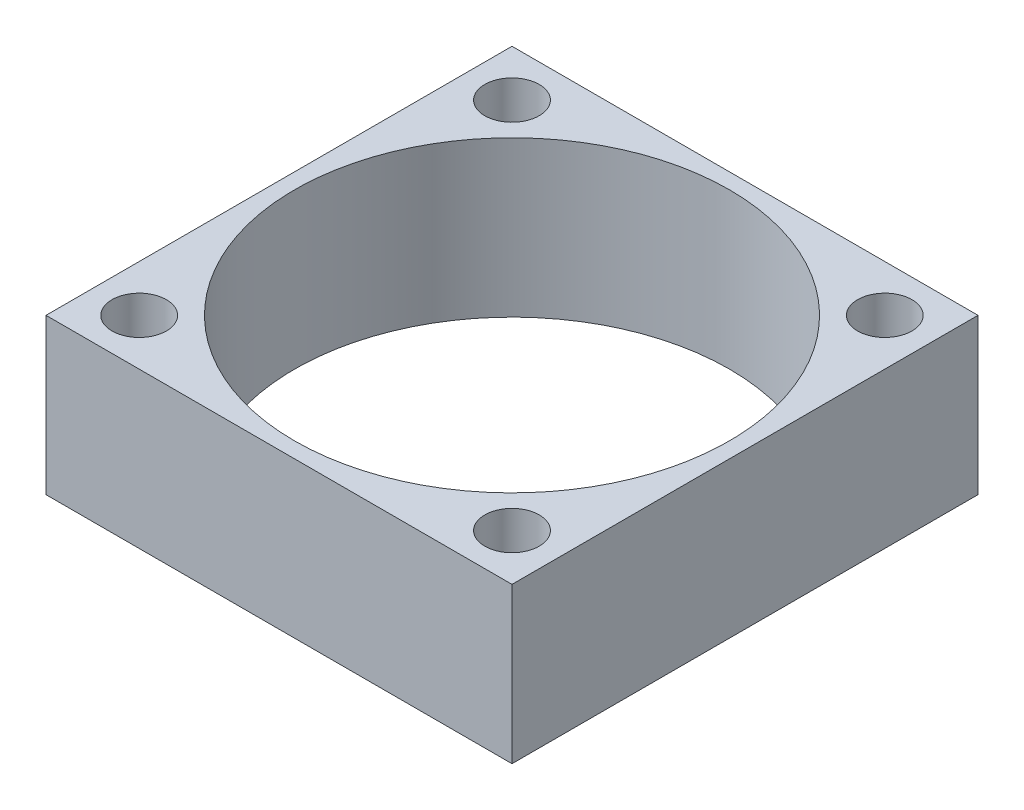
ISO-10303-21;
HEADER;
FILE_DESCRIPTION(('STEP AP214'),'2;1');
FILE_NAME('part.step','',(''),(''),'','','');
FILE_SCHEMA(('AUTOMOTIVE_DESIGN { 1 0 10303 214 1 1 1 1 }'));
ENDSEC;
DATA;
#1=APPLICATION_CONTEXT('core data for automotive mechanical design processes');
#2=APPLICATION_PROTOCOL_DEFINITION('international standard','automotive_design',2000,#1);
#3=PRODUCT_CONTEXT('',#1,'mechanical');
#4=PRODUCT('Part','Part','',(#3));
#5=PRODUCT_RELATED_PRODUCT_CATEGORY('part','',(#4));
#6=PRODUCT_DEFINITION_FORMATION('','',#4);
#7=PRODUCT_DEFINITION_CONTEXT('part definition',#1,'design');
#8=PRODUCT_DEFINITION('design','',#6,#7);
#9=PRODUCT_DEFINITION_SHAPE('','',#8);
#10=(LENGTH_UNIT() NAMED_UNIT(*) SI_UNIT(.MILLI.,.METRE.));
#11=(NAMED_UNIT(*) PLANE_ANGLE_UNIT() SI_UNIT($,.RADIAN.));
#12=(NAMED_UNIT(*) SI_UNIT($,.STERADIAN.) SOLID_ANGLE_UNIT());
#13=UNCERTAINTY_MEASURE_WITH_UNIT(LENGTH_MEASURE(1.E-05),#10,'distance_accuracy_value','');
#14=(GEOMETRIC_REPRESENTATION_CONTEXT(3) GLOBAL_UNCERTAINTY_ASSIGNED_CONTEXT((#13)) GLOBAL_UNIT_ASSIGNED_CONTEXT((#10,
#11,#12)) REPRESENTATION_CONTEXT('',''));
#15=CARTESIAN_POINT('',(0.,0.,0.));
#16=DIRECTION('',(0.,0.,1.));
#17=DIRECTION('',(1.,0.,0.));
#18=AXIS2_PLACEMENT_3D('',#15,#16,#17);
#19=CARTESIAN_POINT('',(0.,10.,0.));
#20=DIRECTION('',(0.,-1.,0.));
#21=DIRECTION('',(0.,0.,-1.));
#22=AXIS2_PLACEMENT_3D('',#19,#20,#21);
#23=PLANE('',#22);
#24=CARTESIAN_POINT('',(3.,10.,-27.));
#25=DIRECTION('',(0.,1.,0.));
#26=DIRECTION('',(0.,0.,1.));
#27=AXIS2_PLACEMENT_3D('',#24,#25,#26);
#28=CIRCLE('',#27,1.74999999999999);
#29=CARTESIAN_POINT('',(3.,10.,-25.25));
#30=VERTEX_POINT('',#29);
#31=EDGE_CURVE('E140',#30,#30,#28,.T.);
#32=ORIENTED_EDGE('',*,*,#31,.F.);
#33=EDGE_LOOP('',(#32));
#34=FACE_BOUND('',#33,.T.);
#35=CARTESIAN_POINT('',(27.,10.,-27.));
#36=DIRECTION('',(0.,1.,0.));
#37=DIRECTION('',(0.,0.,1.));
#38=AXIS2_PLACEMENT_3D('',#35,#36,#37);
#39=CIRCLE('',#38,1.74999999999999);
#40=CARTESIAN_POINT('',(27.,10.,-25.25));
#41=VERTEX_POINT('',#40);
#42=EDGE_CURVE('E134',#41,#41,#39,.T.);
#43=ORIENTED_EDGE('',*,*,#42,.F.);
#44=EDGE_LOOP('',(#43));
#45=FACE_BOUND('',#44,.T.);
#46=CARTESIAN_POINT('',(27.,10.,-3.));
#47=DIRECTION('',(0.,1.,0.));
#48=DIRECTION('',(0.,0.,1.));
#49=AXIS2_PLACEMENT_3D('',#46,#47,#48);
#50=CIRCLE('',#49,1.74999999999999);
#51=CARTESIAN_POINT('',(27.,10.,-1.25000000000001));
#52=VERTEX_POINT('',#51);
#53=EDGE_CURVE('E128',#52,#52,#50,.T.);
#54=ORIENTED_EDGE('',*,*,#53,.F.);
#55=EDGE_LOOP('',(#54));
#56=FACE_BOUND('',#55,.T.);
#57=CARTESIAN_POINT('',(3.,10.,-3.));
#58=DIRECTION('',(0.,1.,0.));
#59=DIRECTION('',(0.,0.,1.));
#60=AXIS2_PLACEMENT_3D('',#57,#58,#59);
#61=CIRCLE('',#60,1.74999999999999);
#62=CARTESIAN_POINT('',(3.,10.,-1.25000000000001));
#63=VERTEX_POINT('',#62);
#64=EDGE_CURVE('E122',#63,#63,#61,.T.);
#65=ORIENTED_EDGE('',*,*,#64,.F.);
#66=EDGE_LOOP('',(#65));
#67=FACE_BOUND('',#66,.T.);
#68=DIRECTION('',(0.,0.,1.));
#69=VECTOR('',#68,1.);
#70=CARTESIAN_POINT('',(0.,10.,0.));
#71=LINE('',#70,#69);
#72=CARTESIAN_POINT('',(0.,10.,-30.));
#73=VERTEX_POINT('',#72);
#74=CARTESIAN_POINT('',(0.,10.,0.));
#75=VERTEX_POINT('',#74);
#76=EDGE_CURVE('E87',#73,#75,#71,.T.);
#77=ORIENTED_EDGE('',*,*,#76,.T.);
#78=DIRECTION('',(1.,0.,0.));
#79=VECTOR('',#78,1.);
#80=CARTESIAN_POINT('',(0.,10.,0.));
#81=LINE('',#80,#79);
#82=CARTESIAN_POINT('',(30.,10.,0.));
#83=VERTEX_POINT('',#82);
#84=EDGE_CURVE('E82',#75,#83,#81,.T.);
#85=ORIENTED_EDGE('',*,*,#84,.T.);
#86=DIRECTION('',(0.,0.,-1.));
#87=VECTOR('',#86,1.);
#88=CARTESIAN_POINT('',(30.,10.,0.));
#89=LINE('',#88,#87);
#90=CARTESIAN_POINT('',(30.,10.,-30.));
#91=VERTEX_POINT('',#90);
#92=EDGE_CURVE('E85',#83,#91,#89,.T.);
#93=ORIENTED_EDGE('',*,*,#92,.T.);
#94=DIRECTION('',(-1.,0.,0.));
#95=VECTOR('',#94,1.);
#96=CARTESIAN_POINT('',(0.,10.,-30.));
#97=LINE('',#96,#95);
#98=EDGE_CURVE('E52',#91,#73,#97,.T.);
#99=ORIENTED_EDGE('',*,*,#98,.T.);
#100=EDGE_LOOP('',(#77,#85,#93,#99));
#101=FACE_BOUND('',#100,.T.);
#102=CARTESIAN_POINT('',(15.,10.,-15.));
#103=DIRECTION('',(0.,1.,0.));
#104=DIRECTION('',(0.,0.,1.));
#105=AXIS2_PLACEMENT_3D('',#102,#103,#104);
#106=CIRCLE('',#105,14.);
#107=CARTESIAN_POINT('',(15.,10.,-0.999999999999999));
#108=VERTEX_POINT('',#107);
#109=EDGE_CURVE('E102',#108,#108,#106,.T.);
#110=ORIENTED_EDGE('',*,*,#109,.F.);
#111=EDGE_LOOP('',(#110));
#112=FACE_BOUND('',#111,.T.);
#113=ADVANCED_FACE('F35',(#34,#45,#56,#67,#101,#112),#23,.F.);
#114=CARTESIAN_POINT('',(0.,0.,0.));
#115=DIRECTION('',(0.,-1.,0.));
#116=DIRECTION('',(0.,0.,-1.));
#117=AXIS2_PLACEMENT_3D('',#114,#115,#116);
#118=PLANE('',#117);
#119=CARTESIAN_POINT('',(3.,0.,-27.));
#120=DIRECTION('',(0.,1.,0.));
#121=DIRECTION('',(0.,0.,1.));
#122=AXIS2_PLACEMENT_3D('',#119,#120,#121);
#123=CIRCLE('',#122,1.75);
#124=CARTESIAN_POINT('',(3.,0.,-25.25));
#125=VERTEX_POINT('',#124);
#126=EDGE_CURVE('E137',#125,#125,#123,.T.);
#127=ORIENTED_EDGE('',*,*,#126,.T.);
#128=EDGE_LOOP('',(#127));
#129=FACE_BOUND('',#128,.T.);
#130=CARTESIAN_POINT('',(27.,0.,-27.));
#131=DIRECTION('',(0.,1.,0.));
#132=DIRECTION('',(0.,0.,1.));
#133=AXIS2_PLACEMENT_3D('',#130,#131,#132);
#134=CIRCLE('',#133,1.75);
#135=CARTESIAN_POINT('',(27.,0.,-25.25));
#136=VERTEX_POINT('',#135);
#137=EDGE_CURVE('E131',#136,#136,#134,.T.);
#138=ORIENTED_EDGE('',*,*,#137,.T.);
#139=EDGE_LOOP('',(#138));
#140=FACE_BOUND('',#139,.T.);
#141=CARTESIAN_POINT('',(27.,0.,-3.));
#142=DIRECTION('',(0.,1.,0.));
#143=DIRECTION('',(0.,0.,1.));
#144=AXIS2_PLACEMENT_3D('',#141,#142,#143);
#145=CIRCLE('',#144,1.75);
#146=CARTESIAN_POINT('',(27.,0.,-1.25));
#147=VERTEX_POINT('',#146);
#148=EDGE_CURVE('E125',#147,#147,#145,.T.);
#149=ORIENTED_EDGE('',*,*,#148,.T.);
#150=EDGE_LOOP('',(#149));
#151=FACE_BOUND('',#150,.T.);
#152=CARTESIAN_POINT('',(3.,0.,-3.));
#153=DIRECTION('',(0.,1.,0.));
#154=DIRECTION('',(0.,0.,1.));
#155=AXIS2_PLACEMENT_3D('',#152,#153,#154);
#156=CIRCLE('',#155,1.75);
#157=CARTESIAN_POINT('',(3.,0.,-1.25));
#158=VERTEX_POINT('',#157);
#159=EDGE_CURVE('E117',#158,#158,#156,.T.);
#160=ORIENTED_EDGE('',*,*,#159,.T.);
#161=EDGE_LOOP('',(#160));
#162=FACE_BOUND('',#161,.T.);
#163=DIRECTION('',(0.,0.,1.));
#164=VECTOR('',#163,1.);
#165=CARTESIAN_POINT('',(0.,0.,0.));
#166=LINE('',#165,#164);
#167=CARTESIAN_POINT('',(0.,0.,-30.));
#168=VERTEX_POINT('',#167);
#169=CARTESIAN_POINT('',(0.,0.,0.));
#170=VERTEX_POINT('',#169);
#171=EDGE_CURVE('E99',#168,#170,#166,.T.);
#172=ORIENTED_EDGE('',*,*,#171,.F.);
#173=DIRECTION('',(-1.,0.,0.));
#174=VECTOR('',#173,1.);
#175=CARTESIAN_POINT('',(0.,0.,-30.));
#176=LINE('',#175,#174);
#177=CARTESIAN_POINT('',(30.,0.,-30.));
#178=VERTEX_POINT('',#177);
#179=EDGE_CURVE('E75',#178,#168,#176,.T.);
#180=ORIENTED_EDGE('',*,*,#179,.F.);
#181=DIRECTION('',(0.,0.,-1.));
#182=VECTOR('',#181,1.);
#183=CARTESIAN_POINT('',(30.,0.,0.));
#184=LINE('',#183,#182);
#185=CARTESIAN_POINT('',(30.,0.,0.));
#186=VERTEX_POINT('',#185);
#187=EDGE_CURVE('E69',#186,#178,#184,.T.);
#188=ORIENTED_EDGE('',*,*,#187,.F.);
#189=DIRECTION('',(1.,0.,0.));
#190=VECTOR('',#189,1.);
#191=CARTESIAN_POINT('',(0.,0.,0.));
#192=LINE('',#191,#190);
#193=EDGE_CURVE('E91',#170,#186,#192,.T.);
#194=ORIENTED_EDGE('',*,*,#193,.F.);
#195=EDGE_LOOP('',(#172,#180,#188,#194));
#196=FACE_BOUND('',#195,.T.);
#197=CARTESIAN_POINT('',(15.,0.,-15.));
#198=DIRECTION('',(0.,1.,0.));
#199=DIRECTION('',(0.,0.,1.));
#200=AXIS2_PLACEMENT_3D('',#197,#198,#199);
#201=CIRCLE('',#200,14.);
#202=CARTESIAN_POINT('',(15.,0.,-0.999999999999999));
#203=VERTEX_POINT('',#202);
#204=EDGE_CURVE('E114',#203,#203,#201,.T.);
#205=ORIENTED_EDGE('',*,*,#204,.T.);
#206=EDGE_LOOP('',(#205));
#207=FACE_BOUND('',#206,.T.);
#208=ADVANCED_FACE('F110',(#129,#140,#151,#162,#196,#207),#118,.T.);
#209=CARTESIAN_POINT('',(0.,10.,0.));
#210=DIRECTION('',(1.,0.,0.));
#211=DIRECTION('',(0.,0.,-1.));
#212=AXIS2_PLACEMENT_3D('',#209,#210,#211);
#213=PLANE('',#212);
#214=ORIENTED_EDGE('',*,*,#171,.T.);
#215=DIRECTION('',(0.,-1.,0.));
#216=VECTOR('',#215,1.);
#217=CARTESIAN_POINT('',(0.,10.,0.));
#218=LINE('',#217,#216);
#219=EDGE_CURVE('E11',#75,#170,#218,.T.);
#220=ORIENTED_EDGE('',*,*,#219,.F.);
#221=ORIENTED_EDGE('',*,*,#76,.F.);
#222=DIRECTION('',(0.,-1.,0.));
#223=VECTOR('',#222,1.);
#224=CARTESIAN_POINT('',(0.,10.,-30.));
#225=LINE('',#224,#223);
#226=EDGE_CURVE('E95',#73,#168,#225,.T.);
#227=ORIENTED_EDGE('',*,*,#226,.T.);
#228=EDGE_LOOP('',(#214,#220,#221,#227));
#229=FACE_BOUND('',#228,.T.);
#230=ADVANCED_FACE('F37',(#229),#213,.F.);
#231=CARTESIAN_POINT('',(0.,10.,0.));
#232=DIRECTION('',(0.,0.,-1.));
#233=DIRECTION('',(-1.,0.,0.));
#234=AXIS2_PLACEMENT_3D('',#231,#232,#233);
#235=PLANE('',#234);
#236=ORIENTED_EDGE('',*,*,#193,.T.);
#237=DIRECTION('',(0.,-1.,0.));
#238=VECTOR('',#237,1.);
#239=CARTESIAN_POINT('',(30.,10.,0.));
#240=LINE('',#239,#238);
#241=EDGE_CURVE('E44',#83,#186,#240,.T.);
#242=ORIENTED_EDGE('',*,*,#241,.F.);
#243=ORIENTED_EDGE('',*,*,#84,.F.);
#244=ORIENTED_EDGE('',*,*,#219,.T.);
#245=EDGE_LOOP('',(#236,#242,#243,#244));
#246=FACE_BOUND('',#245,.T.);
#247=ADVANCED_FACE('F90',(#246),#235,.F.);
#248=CARTESIAN_POINT('',(30.,10.,0.));
#249=DIRECTION('',(-1.,0.,0.));
#250=DIRECTION('',(0.,0.,1.));
#251=AXIS2_PLACEMENT_3D('',#248,#249,#250);
#252=PLANE('',#251);
#253=ORIENTED_EDGE('',*,*,#187,.T.);
#254=DIRECTION('',(0.,-1.,0.));
#255=VECTOR('',#254,1.);
#256=CARTESIAN_POINT('',(30.,10.,-30.));
#257=LINE('',#256,#255);
#258=EDGE_CURVE('E92',#91,#178,#257,.T.);
#259=ORIENTED_EDGE('',*,*,#258,.F.);
#260=ORIENTED_EDGE('',*,*,#92,.F.);
#261=ORIENTED_EDGE('',*,*,#241,.T.);
#262=EDGE_LOOP('',(#253,#259,#260,#261));
#263=FACE_BOUND('',#262,.T.);
#264=ADVANCED_FACE('F93',(#263),#252,.F.);
#265=CARTESIAN_POINT('',(0.,10.,-30.));
#266=DIRECTION('',(0.,0.,1.));
#267=DIRECTION('',(1.,0.,0.));
#268=AXIS2_PLACEMENT_3D('',#265,#266,#267);
#269=PLANE('',#268);
#270=ORIENTED_EDGE('',*,*,#179,.T.);
#271=ORIENTED_EDGE('',*,*,#226,.F.);
#272=ORIENTED_EDGE('',*,*,#98,.F.);
#273=ORIENTED_EDGE('',*,*,#258,.T.);
#274=EDGE_LOOP('',(#270,#271,#272,#273));
#275=FACE_BOUND('',#274,.T.);
#276=ADVANCED_FACE('F107',(#275),#269,.F.);
#277=CARTESIAN_POINT('',(15.,10.,-15.));
#278=DIRECTION('',(0.,-1.,0.));
#279=DIRECTION('',(0.,0.,-1.));
#280=AXIS2_PLACEMENT_3D('',#277,#278,#279);
#281=CYLINDRICAL_SURFACE('',#280,14.);
#282=ORIENTED_EDGE('',*,*,#109,.T.);
#283=EDGE_LOOP('',(#282));
#284=FACE_BOUND('',#283,.T.);
#285=ORIENTED_EDGE('',*,*,#204,.F.);
#286=EDGE_LOOP('',(#285));
#287=FACE_BOUND('',#286,.T.);
#288=ADVANCED_FACE('F158',(#284,#287),#281,.F.);
#289=CARTESIAN_POINT('',(3.,10.,-3.));
#290=DIRECTION('',(0.,1.,0.));
#291=DIRECTION('',(0.,0.,1.));
#292=AXIS2_PLACEMENT_3D('',#289,#290,#291);
#293=CYLINDRICAL_SURFACE('',#292,1.74999999999999);
#294=ORIENTED_EDGE('',*,*,#159,.F.);
#295=EDGE_LOOP('',(#294));
#296=FACE_BOUND('',#295,.T.);
#297=ORIENTED_EDGE('',*,*,#64,.T.);
#298=EDGE_LOOP('',(#297));
#299=FACE_BOUND('',#298,.T.);
#300=ADVANCED_FACE('F155',(#296,#299),#293,.F.);
#301=CARTESIAN_POINT('',(27.,10.,-3.));
#302=DIRECTION('',(0.,1.,0.));
#303=DIRECTION('',(0.,0.,1.));
#304=AXIS2_PLACEMENT_3D('',#301,#302,#303);
#305=CYLINDRICAL_SURFACE('',#304,1.74999999999999);
#306=ORIENTED_EDGE('',*,*,#148,.F.);
#307=EDGE_LOOP('',(#306));
#308=FACE_BOUND('',#307,.T.);
#309=ORIENTED_EDGE('',*,*,#53,.T.);
#310=EDGE_LOOP('',(#309));
#311=FACE_BOUND('',#310,.T.);
#312=ADVANCED_FACE('F157',(#308,#311),#305,.F.);
#313=CARTESIAN_POINT('',(27.,10.,-27.));
#314=DIRECTION('',(0.,1.,0.));
#315=DIRECTION('',(0.,0.,1.));
#316=AXIS2_PLACEMENT_3D('',#313,#314,#315);
#317=CYLINDRICAL_SURFACE('',#316,1.74999999999999);
#318=ORIENTED_EDGE('',*,*,#137,.F.);
#319=EDGE_LOOP('',(#318));
#320=FACE_BOUND('',#319,.T.);
#321=ORIENTED_EDGE('',*,*,#42,.T.);
#322=EDGE_LOOP('',(#321));
#323=FACE_BOUND('',#322,.T.);
#324=ADVANCED_FACE('F165',(#320,#323),#317,.F.);
#325=CARTESIAN_POINT('',(3.,10.,-27.));
#326=DIRECTION('',(0.,1.,0.));
#327=DIRECTION('',(0.,0.,1.));
#328=AXIS2_PLACEMENT_3D('',#325,#326,#327);
#329=CYLINDRICAL_SURFACE('',#328,1.74999999999999);
#330=ORIENTED_EDGE('',*,*,#126,.F.);
#331=EDGE_LOOP('',(#330));
#332=FACE_BOUND('',#331,.T.);
#333=ORIENTED_EDGE('',*,*,#31,.T.);
#334=EDGE_LOOP('',(#333));
#335=FACE_BOUND('',#334,.T.);
#336=ADVANCED_FACE('F144',(#332,#335),#329,.F.);
#337=CLOSED_SHELL('',(#113,#208,#230,#247,#264,#276,#288,#300,#312,#324,#336));
#338=MANIFOLD_SOLID_BREP('B2',#337);
#339=ADVANCED_BREP_SHAPE_REPRESENTATION('',(#18,#338),#14);
#340=SHAPE_DEFINITION_REPRESENTATION(#9,#339);
ENDSEC;
END-ISO-10303-21;
